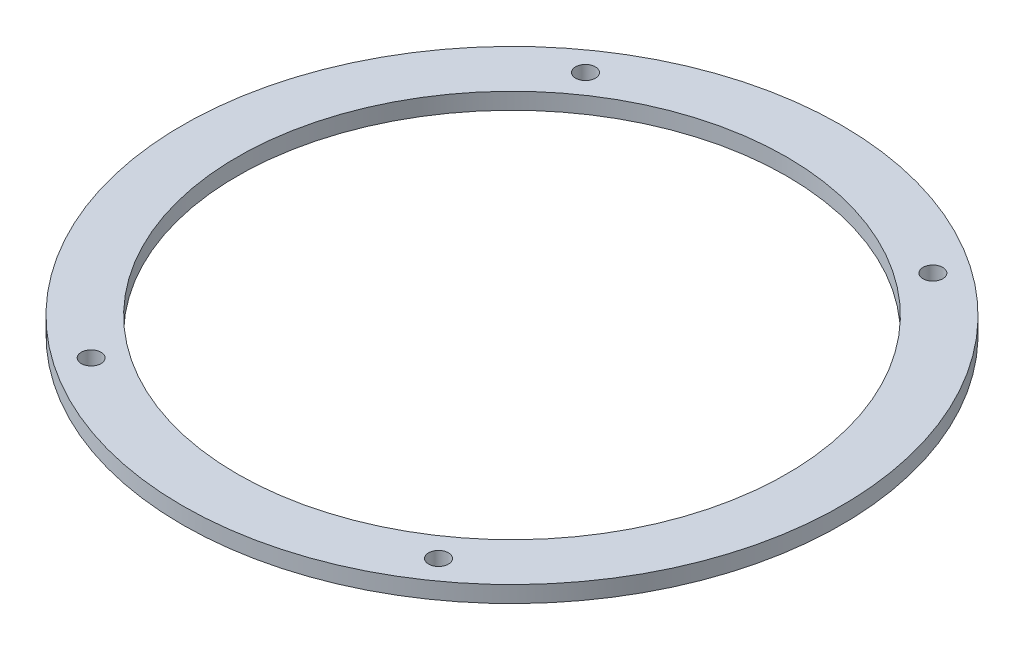
ISO-10303-21;
HEADER;
FILE_DESCRIPTION(('STEP AP214'),'2;1');
FILE_NAME('part.step','',(''),(''),'','','');
FILE_SCHEMA(('AUTOMOTIVE_DESIGN { 1 0 10303 214 1 1 1 1 }'));
ENDSEC;
DATA;
#1=APPLICATION_CONTEXT('core data for automotive mechanical design processes');
#2=APPLICATION_PROTOCOL_DEFINITION('international standard','automotive_design',2000,#1);
#3=PRODUCT_CONTEXT('',#1,'mechanical');
#4=PRODUCT('Part','Part','',(#3));
#5=PRODUCT_RELATED_PRODUCT_CATEGORY('part','',(#4));
#6=PRODUCT_DEFINITION_FORMATION('','',#4);
#7=PRODUCT_DEFINITION_CONTEXT('part definition',#1,'design');
#8=PRODUCT_DEFINITION('design','',#6,#7);
#9=PRODUCT_DEFINITION_SHAPE('','',#8);
#10=(LENGTH_UNIT() NAMED_UNIT(*) SI_UNIT(.MILLI.,.METRE.));
#11=(NAMED_UNIT(*) PLANE_ANGLE_UNIT() SI_UNIT($,.RADIAN.));
#12=(NAMED_UNIT(*) SI_UNIT($,.STERADIAN.) SOLID_ANGLE_UNIT());
#13=UNCERTAINTY_MEASURE_WITH_UNIT(LENGTH_MEASURE(1.E-05),#10,'distance_accuracy_value','');
#14=(GEOMETRIC_REPRESENTATION_CONTEXT(3) GLOBAL_UNCERTAINTY_ASSIGNED_CONTEXT((#13)) GLOBAL_UNIT_ASSIGNED_CONTEXT((#10,
#11,#12)) REPRESENTATION_CONTEXT('',''));
#15=CARTESIAN_POINT('',(0.,0.,0.));
#16=DIRECTION('',(0.,0.,1.));
#17=DIRECTION('',(1.,0.,0.));
#18=AXIS2_PLACEMENT_3D('',#15,#16,#17);
#19=CARTESIAN_POINT('',(0.,3.,0.));
#20=DIRECTION('',(0.,1.,0.));
#21=DIRECTION('',(0.,0.,1.));
#22=AXIS2_PLACEMENT_3D('',#19,#20,#21);
#23=PLANE('',#22);
#24=CARTESIAN_POINT('',(-31.6227766016838,3.,45.));
#25=DIRECTION('',(0.,1.,0.));
#26=DIRECTION('',(0.,0.,1.));
#27=AXIS2_PLACEMENT_3D('',#24,#25,#26);
#28=CIRCLE('',#27,1.79999999999999);
#29=CARTESIAN_POINT('',(-31.6227766016838,3.,46.8));
#30=VERTEX_POINT('',#29);
#31=EDGE_CURVE('E74',#30,#30,#28,.T.);
#32=ORIENTED_EDGE('',*,*,#31,.F.);
#33=EDGE_LOOP('',(#32));
#34=FACE_BOUND('',#33,.T.);
#35=CARTESIAN_POINT('',(31.6227766016838,3.,45.));
#36=DIRECTION('',(0.,1.,0.));
#37=DIRECTION('',(0.,0.,1.));
#38=AXIS2_PLACEMENT_3D('',#35,#36,#37);
#39=CIRCLE('',#38,1.79999999999999);
#40=CARTESIAN_POINT('',(31.6227766016838,3.,46.8));
#41=VERTEX_POINT('',#40);
#42=EDGE_CURVE('E68',#41,#41,#39,.T.);
#43=ORIENTED_EDGE('',*,*,#42,.F.);
#44=EDGE_LOOP('',(#43));
#45=FACE_BOUND('',#44,.T.);
#46=CARTESIAN_POINT('',(-31.6227766016838,3.,-45.));
#47=DIRECTION('',(0.,1.,0.));
#48=DIRECTION('',(0.,0.,1.));
#49=AXIS2_PLACEMENT_3D('',#46,#47,#48);
#50=CIRCLE('',#49,1.79999999999999);
#51=CARTESIAN_POINT('',(-31.6227766016838,3.,-43.2));
#52=VERTEX_POINT('',#51);
#53=EDGE_CURVE('E62',#52,#52,#50,.T.);
#54=ORIENTED_EDGE('',*,*,#53,.F.);
#55=EDGE_LOOP('',(#54));
#56=FACE_BOUND('',#55,.T.);
#57=CARTESIAN_POINT('',(31.6227766016838,3.,-45.));
#58=DIRECTION('',(0.,1.,0.));
#59=DIRECTION('',(0.,0.,1.));
#60=AXIS2_PLACEMENT_3D('',#57,#58,#59);
#61=CIRCLE('',#60,1.79999999999999);
#62=CARTESIAN_POINT('',(31.6227766016838,3.,-43.2));
#63=VERTEX_POINT('',#62);
#64=EDGE_CURVE('E56',#63,#63,#61,.T.);
#65=ORIENTED_EDGE('',*,*,#64,.F.);
#66=EDGE_LOOP('',(#65));
#67=FACE_BOUND('',#66,.T.);
#68=CARTESIAN_POINT('',(0.,3.,0.));
#69=DIRECTION('',(0.,1.,0.));
#70=DIRECTION('',(0.,0.,1.));
#71=AXIS2_PLACEMENT_3D('',#68,#69,#70);
#72=CIRCLE('',#71,60.);
#73=CARTESIAN_POINT('',(0.,3.,60.));
#74=VERTEX_POINT('',#73);
#75=EDGE_CURVE('E10',#74,#74,#72,.T.);
#76=ORIENTED_EDGE('',*,*,#75,.T.);
#77=EDGE_LOOP('',(#76));
#78=FACE_BOUND('',#77,.T.);
#79=CARTESIAN_POINT('',(0.,3.,0.));
#80=DIRECTION('',(0.,1.,0.));
#81=DIRECTION('',(0.,0.,1.));
#82=AXIS2_PLACEMENT_3D('',#79,#80,#81);
#83=CIRCLE('',#82,50.);
#84=CARTESIAN_POINT('',(0.,3.,50.));
#85=VERTEX_POINT('',#84);
#86=EDGE_CURVE('E46',#85,#85,#83,.T.);
#87=ORIENTED_EDGE('',*,*,#86,.F.);
#88=EDGE_LOOP('',(#87));
#89=FACE_BOUND('',#88,.T.);
#90=ADVANCED_FACE('F35',(#34,#45,#56,#67,#78,#89),#23,.T.);
#91=CARTESIAN_POINT('',(0.,0.,0.));
#92=DIRECTION('',(0.,1.,0.));
#93=DIRECTION('',(0.,0.,1.));
#94=AXIS2_PLACEMENT_3D('',#91,#92,#93);
#95=PLANE('',#94);
#96=CARTESIAN_POINT('',(-31.6227766016838,0.,45.));
#97=DIRECTION('',(0.,1.,0.));
#98=DIRECTION('',(0.,0.,1.));
#99=AXIS2_PLACEMENT_3D('',#96,#97,#98);
#100=CIRCLE('',#99,1.8);
#101=CARTESIAN_POINT('',(-31.6227766016838,0.,46.8));
#102=VERTEX_POINT('',#101);
#103=EDGE_CURVE('E71',#102,#102,#100,.T.);
#104=ORIENTED_EDGE('',*,*,#103,.T.);
#105=EDGE_LOOP('',(#104));
#106=FACE_BOUND('',#105,.T.);
#107=CARTESIAN_POINT('',(31.6227766016838,0.,45.));
#108=DIRECTION('',(0.,1.,0.));
#109=DIRECTION('',(0.,0.,1.));
#110=AXIS2_PLACEMENT_3D('',#107,#108,#109);
#111=CIRCLE('',#110,1.8);
#112=CARTESIAN_POINT('',(31.6227766016838,0.,46.8));
#113=VERTEX_POINT('',#112);
#114=EDGE_CURVE('E65',#113,#113,#111,.T.);
#115=ORIENTED_EDGE('',*,*,#114,.T.);
#116=EDGE_LOOP('',(#115));
#117=FACE_BOUND('',#116,.T.);
#118=CARTESIAN_POINT('',(-31.6227766016838,0.,-45.));
#119=DIRECTION('',(0.,1.,0.));
#120=DIRECTION('',(0.,0.,1.));
#121=AXIS2_PLACEMENT_3D('',#118,#119,#120);
#122=CIRCLE('',#121,1.8);
#123=CARTESIAN_POINT('',(-31.6227766016838,0.,-43.2));
#124=VERTEX_POINT('',#123);
#125=EDGE_CURVE('E59',#124,#124,#122,.T.);
#126=ORIENTED_EDGE('',*,*,#125,.T.);
#127=EDGE_LOOP('',(#126));
#128=FACE_BOUND('',#127,.T.);
#129=CARTESIAN_POINT('',(31.6227766016838,0.,-45.));
#130=DIRECTION('',(0.,1.,0.));
#131=DIRECTION('',(0.,0.,1.));
#132=AXIS2_PLACEMENT_3D('',#129,#130,#131);
#133=CIRCLE('',#132,1.8);
#134=CARTESIAN_POINT('',(31.6227766016838,0.,-43.2));
#135=VERTEX_POINT('',#134);
#136=EDGE_CURVE('E51',#135,#135,#133,.T.);
#137=ORIENTED_EDGE('',*,*,#136,.T.);
#138=EDGE_LOOP('',(#137));
#139=FACE_BOUND('',#138,.T.);
#140=CARTESIAN_POINT('',(0.,0.,0.));
#141=DIRECTION('',(0.,1.,0.));
#142=DIRECTION('',(0.,0.,1.));
#143=AXIS2_PLACEMENT_3D('',#140,#141,#142);
#144=CIRCLE('',#143,60.);
#145=CARTESIAN_POINT('',(0.,0.,60.));
#146=VERTEX_POINT('',#145);
#147=EDGE_CURVE('E39',#146,#146,#144,.T.);
#148=ORIENTED_EDGE('',*,*,#147,.F.);
#149=EDGE_LOOP('',(#148));
#150=FACE_BOUND('',#149,.T.);
#151=CARTESIAN_POINT('',(0.,0.,0.));
#152=DIRECTION('',(0.,1.,0.));
#153=DIRECTION('',(0.,0.,1.));
#154=AXIS2_PLACEMENT_3D('',#151,#152,#153);
#155=CIRCLE('',#154,50.);
#156=CARTESIAN_POINT('',(0.,0.,50.));
#157=VERTEX_POINT('',#156);
#158=EDGE_CURVE('E48',#157,#157,#155,.T.);
#159=ORIENTED_EDGE('',*,*,#158,.T.);
#160=EDGE_LOOP('',(#159));
#161=FACE_BOUND('',#160,.T.);
#162=ADVANCED_FACE('F82',(#106,#117,#128,#139,#150,#161),#95,.F.);
#163=CARTESIAN_POINT('',(0.,3.,0.));
#164=DIRECTION('',(0.,-1.,0.));
#165=DIRECTION('',(0.,0.,-1.));
#166=AXIS2_PLACEMENT_3D('',#163,#164,#165);
#167=CYLINDRICAL_SURFACE('',#166,60.);
#168=ORIENTED_EDGE('',*,*,#75,.F.);
#169=EDGE_LOOP('',(#168));
#170=FACE_BOUND('',#169,.T.);
#171=ORIENTED_EDGE('',*,*,#147,.T.);
#172=EDGE_LOOP('',(#171));
#173=FACE_BOUND('',#172,.T.);
#174=ADVANCED_FACE('F37',(#170,#173),#167,.T.);
#175=CARTESIAN_POINT('',(0.,3.,0.));
#176=DIRECTION('',(0.,-1.,0.));
#177=DIRECTION('',(0.,0.,-1.));
#178=AXIS2_PLACEMENT_3D('',#175,#176,#177);
#179=CYLINDRICAL_SURFACE('',#178,50.);
#180=ORIENTED_EDGE('',*,*,#86,.T.);
#181=EDGE_LOOP('',(#180));
#182=FACE_BOUND('',#181,.T.);
#183=ORIENTED_EDGE('',*,*,#158,.F.);
#184=EDGE_LOOP('',(#183));
#185=FACE_BOUND('',#184,.T.);
#186=ADVANCED_FACE('F92',(#182,#185),#179,.F.);
#187=CARTESIAN_POINT('',(31.6227766016838,3.,-45.));
#188=DIRECTION('',(0.,1.,0.));
#189=DIRECTION('',(0.,0.,1.));
#190=AXIS2_PLACEMENT_3D('',#187,#188,#189);
#191=CYLINDRICAL_SURFACE('',#190,1.79999999999999);
#192=ORIENTED_EDGE('',*,*,#136,.F.);
#193=EDGE_LOOP('',(#192));
#194=FACE_BOUND('',#193,.T.);
#195=ORIENTED_EDGE('',*,*,#64,.T.);
#196=EDGE_LOOP('',(#195));
#197=FACE_BOUND('',#196,.T.);
#198=ADVANCED_FACE('F95',(#194,#197),#191,.F.);
#199=CARTESIAN_POINT('',(-31.6227766016838,3.,-45.));
#200=DIRECTION('',(0.,1.,0.));
#201=DIRECTION('',(0.,0.,1.));
#202=AXIS2_PLACEMENT_3D('',#199,#200,#201);
#203=CYLINDRICAL_SURFACE('',#202,1.79999999999999);
#204=ORIENTED_EDGE('',*,*,#125,.F.);
#205=EDGE_LOOP('',(#204));
#206=FACE_BOUND('',#205,.T.);
#207=ORIENTED_EDGE('',*,*,#53,.T.);
#208=EDGE_LOOP('',(#207));
#209=FACE_BOUND('',#208,.T.);
#210=ADVANCED_FACE('F109',(#206,#209),#203,.F.);
#211=CARTESIAN_POINT('',(31.6227766016838,3.,45.));
#212=DIRECTION('',(0.,1.,0.));
#213=DIRECTION('',(0.,0.,1.));
#214=AXIS2_PLACEMENT_3D('',#211,#212,#213);
#215=CYLINDRICAL_SURFACE('',#214,1.79999999999999);
#216=ORIENTED_EDGE('',*,*,#114,.F.);
#217=EDGE_LOOP('',(#216));
#218=FACE_BOUND('',#217,.T.);
#219=ORIENTED_EDGE('',*,*,#42,.T.);
#220=EDGE_LOOP('',(#219));
#221=FACE_BOUND('',#220,.T.);
#222=ADVANCED_FACE('F113',(#218,#221),#215,.F.);
#223=CARTESIAN_POINT('',(-31.6227766016838,3.,45.));
#224=DIRECTION('',(0.,1.,0.));
#225=DIRECTION('',(0.,0.,1.));
#226=AXIS2_PLACEMENT_3D('',#223,#224,#225);
#227=CYLINDRICAL_SURFACE('',#226,1.79999999999999);
#228=ORIENTED_EDGE('',*,*,#103,.F.);
#229=EDGE_LOOP('',(#228));
#230=FACE_BOUND('',#229,.T.);
#231=ORIENTED_EDGE('',*,*,#31,.T.);
#232=EDGE_LOOP('',(#231));
#233=FACE_BOUND('',#232,.T.);
#234=ADVANCED_FACE('F78',(#230,#233),#227,.F.);
#235=CLOSED_SHELL('',(#90,#162,#174,#186,#198,#210,#222,#234));
#236=MANIFOLD_SOLID_BREP('B2',#235);
#237=ADVANCED_BREP_SHAPE_REPRESENTATION('',(#18,#236),#14);
#238=SHAPE_DEFINITION_REPRESENTATION(#9,#237);
ENDSEC;
END-ISO-10303-21;
